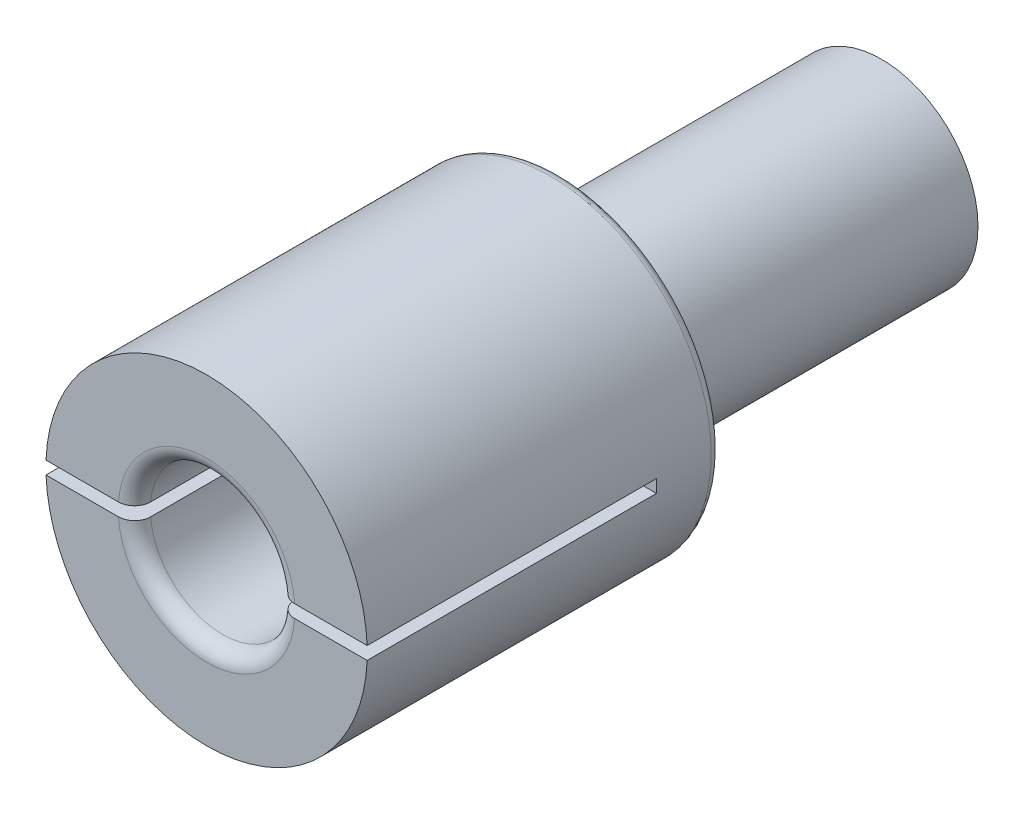
ISO-10303-21;
HEADER;
FILE_DESCRIPTION(('STEP AP214'),'2;1');
FILE_NAME('part.step','',(''),(''),'','','');
FILE_SCHEMA(('AUTOMOTIVE_DESIGN { 1 0 10303 214 1 1 1 1 }'));
ENDSEC;
DATA;
#1=APPLICATION_CONTEXT('core data for automotive mechanical design processes');
#2=APPLICATION_PROTOCOL_DEFINITION('international standard','automotive_design',2000,#1);
#3=PRODUCT_CONTEXT('',#1,'mechanical');
#4=PRODUCT('Part','Part','',(#3));
#5=PRODUCT_RELATED_PRODUCT_CATEGORY('part','',(#4));
#6=PRODUCT_DEFINITION_FORMATION('','',#4);
#7=PRODUCT_DEFINITION_CONTEXT('part definition',#1,'design');
#8=PRODUCT_DEFINITION('design','',#6,#7);
#9=PRODUCT_DEFINITION_SHAPE('','',#8);
#10=(LENGTH_UNIT() NAMED_UNIT(*) SI_UNIT(.MILLI.,.METRE.));
#11=(NAMED_UNIT(*) PLANE_ANGLE_UNIT() SI_UNIT($,.RADIAN.));
#12=(NAMED_UNIT(*) SI_UNIT($,.STERADIAN.) SOLID_ANGLE_UNIT());
#13=UNCERTAINTY_MEASURE_WITH_UNIT(LENGTH_MEASURE(1.E-05),#10,'distance_accuracy_value','');
#14=(GEOMETRIC_REPRESENTATION_CONTEXT(3) GLOBAL_UNCERTAINTY_ASSIGNED_CONTEXT((#13)) GLOBAL_UNIT_ASSIGNED_CONTEXT((#10,
#11,#12)) REPRESENTATION_CONTEXT('',''));
#15=CARTESIAN_POINT('',(0.,0.,0.));
#16=DIRECTION('',(0.,0.,1.));
#17=DIRECTION('',(1.,0.,0.));
#18=AXIS2_PLACEMENT_3D('',#15,#16,#17);
#19=CARTESIAN_POINT('',(-26.1833274784012,4.38375634517767,11.));
#20=DIRECTION('',(0.,0.,1.));
#21=DIRECTION('',(1.,0.,0.));
#22=AXIS2_PLACEMENT_3D('',#19,#20,#21);
#23=PLANE('',#22);
#24=DIRECTION('',(-1.,0.,0.));
#25=VECTOR('',#24,1.);
#26=CARTESIAN_POINT('',(-31.1833274784012,4.58375634517767,11.));
#27=LINE('',#26,#25);
#28=CARTESIAN_POINT('',(-28.9260451087817,4.58375634517767,11.));
#29=VERTEX_POINT('',#28);
#30=CARTESIAN_POINT('',(-31.1793258771199,4.58375634517767,11.));
#31=VERTEX_POINT('',#30);
#32=EDGE_CURVE('E130',#29,#31,#27,.T.);
#33=ORIENTED_EDGE('',*,*,#32,.F.);
#34=CARTESIAN_POINT('',(-26.1833274784012,4.38375634517767,11.));
#35=DIRECTION('',(0.,0.,1.));
#36=DIRECTION('',(1.,0.,0.));
#37=AXIS2_PLACEMENT_3D('',#34,#35,#36);
#38=CIRCLE('',#37,2.75);
#39=CARTESIAN_POINT('',(-23.4406098480207,4.58375634517767,11.));
#40=VERTEX_POINT('',#39);
#41=EDGE_CURVE('E46',#29,#40,#38,.F.);
#42=ORIENTED_EDGE('',*,*,#41,.T.);
#43=CARTESIAN_POINT('',(-21.1873290796824,4.58375634517767,11.));
#44=VERTEX_POINT('',#43);
#45=EDGE_CURVE('E366',#44,#40,#27,.T.);
#46=ORIENTED_EDGE('',*,*,#45,.F.);
#47=CARTESIAN_POINT('',(-26.1833274784012,4.38375634517767,11.));
#48=DIRECTION('',(0.,0.,1.));
#49=DIRECTION('',(1.,0.,0.));
#50=AXIS2_PLACEMENT_3D('',#47,#48,#49);
#51=CIRCLE('',#50,5.);
#52=EDGE_CURVE('E136',#44,#31,#51,.T.);
#53=ORIENTED_EDGE('',*,*,#52,.T.);
#54=EDGE_LOOP('',(#33,#42,#46,#53));
#55=FACE_BOUND('',#54,.T.);
#56=ADVANCED_FACE('F31',(#55),#23,.T.);
#57=CARTESIAN_POINT('',(-26.1833274784012,4.38375634517767,0.));
#58=DIRECTION('',(0.,0.,1.));
#59=DIRECTION('',(1.,0.,0.));
#60=AXIS2_PLACEMENT_3D('',#57,#58,#59);
#61=PLANE('',#60);
#62=CARTESIAN_POINT('',(-26.1833274784012,4.38375634517767,0.));
#63=DIRECTION('',(0.,0.,1.));
#64=DIRECTION('',(1.,0.,0.));
#65=AXIS2_PLACEMENT_3D('',#62,#63,#64);
#66=CIRCLE('',#65,4.7);
#67=CARTESIAN_POINT('',(-21.4833274784012,4.38375634517767,0.));
#68=VERTEX_POINT('',#67);
#69=EDGE_CURVE('E11',#68,#68,#66,.F.);
#70=ORIENTED_EDGE('',*,*,#69,.T.);
#71=EDGE_LOOP('',(#70));
#72=FACE_BOUND('',#71,.T.);
#73=CARTESIAN_POINT('',(-26.1833274784012,4.38375634517767,0.));
#74=DIRECTION('',(0.,0.,1.));
#75=DIRECTION('',(1.,0.,0.));
#76=AXIS2_PLACEMENT_3D('',#73,#74,#75);
#77=CIRCLE('',#76,3.);
#78=CARTESIAN_POINT('',(-23.1833274784012,4.38375634517767,0.));
#79=VERTEX_POINT('',#78);
#80=EDGE_CURVE('E140',#79,#79,#77,.F.);
#81=ORIENTED_EDGE('',*,*,#80,.F.);
#82=EDGE_LOOP('',(#81));
#83=FACE_BOUND('',#82,.T.);
#84=ADVANCED_FACE('F221',(#72,#83),#61,.F.);
#85=CARTESIAN_POINT('',(-26.1833274784012,4.38375634517767,11.));
#86=DIRECTION('',(0.,0.,-1.));
#87=DIRECTION('',(-1.,0.,0.));
#88=AXIS2_PLACEMENT_3D('',#85,#86,#87);
#89=CYLINDRICAL_SURFACE('',#88,5.);
#90=CARTESIAN_POINT('',(-26.1833274784012,4.38375634517767,0.3));
#91=DIRECTION('',(0.,0.,1.));
#92=DIRECTION('',(1.,0.,0.));
#93=AXIS2_PLACEMENT_3D('',#90,#91,#92);
#94=CIRCLE('',#93,5.);
#95=CARTESIAN_POINT('',(-21.1833274784012,4.38375634517767,0.3));
#96=VERTEX_POINT('',#95);
#97=EDGE_CURVE('E39',#96,#96,#94,.T.);
#98=ORIENTED_EDGE('',*,*,#97,.T.);
#99=EDGE_LOOP('',(#98));
#100=FACE_BOUND('',#99,.T.);
#101=CARTESIAN_POINT('',(-26.1833274784012,4.38375634517767,2.));
#102=DIRECTION('',(0.,0.,1.));
#103=DIRECTION('',(1.,0.,0.));
#104=AXIS2_PLACEMENT_3D('',#101,#102,#103);
#105=CIRCLE('',#104,5.);
#106=CARTESIAN_POINT('',(-31.1793258771199,4.58375634517767,2.));
#107=VERTEX_POINT('',#106);
#108=CARTESIAN_POINT('',(-31.1793258771199,4.18375634517767,2.));
#109=VERTEX_POINT('',#108);
#110=EDGE_CURVE('E362',#107,#109,#105,.T.);
#111=ORIENTED_EDGE('',*,*,#110,.F.);
#112=DIRECTION('',(0.,0.,-1.));
#113=VECTOR('',#112,1.);
#114=CARTESIAN_POINT('',(-31.1793258771199,4.58375634517767,11.));
#115=LINE('',#114,#113);
#116=EDGE_CURVE('E120',#107,#31,#115,.F.);
#117=ORIENTED_EDGE('',*,*,#116,.T.);
#118=ORIENTED_EDGE('',*,*,#52,.F.);
#119=DIRECTION('',(0.,0.,-1.));
#120=VECTOR('',#119,1.);
#121=CARTESIAN_POINT('',(-21.1873290796824,4.58375634517767,11.));
#122=LINE('',#121,#120);
#123=CARTESIAN_POINT('',(-21.1873290796824,4.58375634517767,2.));
#124=VERTEX_POINT('',#123);
#125=EDGE_CURVE('E355',#44,#124,#122,.T.);
#126=ORIENTED_EDGE('',*,*,#125,.T.);
#127=CARTESIAN_POINT('',(-21.1873290796824,4.18375634517767,2.));
#128=VERTEX_POINT('',#127);
#129=EDGE_CURVE('E363',#128,#124,#105,.T.);
#130=ORIENTED_EDGE('',*,*,#129,.F.);
#131=DIRECTION('',(0.,0.,-1.));
#132=VECTOR('',#131,1.);
#133=CARTESIAN_POINT('',(-21.1873290796824,4.18375634517767,11.));
#134=LINE('',#133,#132);
#135=CARTESIAN_POINT('',(-21.1873290796824,4.18375634517767,11.));
#136=VERTEX_POINT('',#135);
#137=EDGE_CURVE('E121',#128,#136,#134,.F.);
#138=ORIENTED_EDGE('',*,*,#137,.T.);
#139=CARTESIAN_POINT('',(-31.1793258771199,4.18375634517767,11.));
#140=VERTEX_POINT('',#139);
#141=EDGE_CURVE('E127',#140,#136,#51,.T.);
#142=ORIENTED_EDGE('',*,*,#141,.F.);
#143=DIRECTION('',(0.,0.,-1.));
#144=VECTOR('',#143,1.);
#145=CARTESIAN_POINT('',(-31.1793258771199,4.18375634517767,11.));
#146=LINE('',#145,#144);
#147=EDGE_CURVE('E110',#140,#109,#146,.T.);
#148=ORIENTED_EDGE('',*,*,#147,.T.);
#149=EDGE_LOOP('',(#111,#117,#118,#126,#130,#138,#142,#148));
#150=FACE_BOUND('',#149,.T.);
#151=ADVANCED_FACE('F134',(#100,#150),#89,.T.);
#152=DIRECTION('',(1.,0.,0.));
#153=VECTOR('',#152,1.);
#154=CARTESIAN_POINT('',(-31.1833274784012,4.18375634517767,11.));
#155=LINE('',#154,#153);
#156=CARTESIAN_POINT('',(-23.4406098480207,4.18375634517767,11.));
#157=VERTEX_POINT('',#156);
#158=EDGE_CURVE('E131',#157,#136,#155,.T.);
#159=ORIENTED_EDGE('',*,*,#158,.F.);
#160=CARTESIAN_POINT('',(-26.1833274784012,4.38375634517767,11.));
#161=DIRECTION('',(0.,0.,1.));
#162=DIRECTION('',(1.,0.,0.));
#163=AXIS2_PLACEMENT_3D('',#160,#161,#162);
#164=CIRCLE('',#163,2.75);
#165=CARTESIAN_POINT('',(-28.9260451087817,4.18375634517767,11.));
#166=VERTEX_POINT('',#165);
#167=EDGE_CURVE('E129',#157,#166,#164,.F.);
#168=ORIENTED_EDGE('',*,*,#167,.T.);
#169=EDGE_CURVE('E113',#140,#166,#155,.T.);
#170=ORIENTED_EDGE('',*,*,#169,.F.);
#171=ORIENTED_EDGE('',*,*,#141,.T.);
#172=EDGE_LOOP('',(#159,#168,#170,#171));
#173=FACE_BOUND('',#172,.T.);
#174=ADVANCED_FACE('F126',(#173),#23,.T.);
#175=CARTESIAN_POINT('',(-26.1833274784012,4.38375634517767,0.));
#176=DIRECTION('',(0.,0.,1.));
#177=DIRECTION('',(1.,0.,0.));
#178=AXIS2_PLACEMENT_3D('',#175,#176,#177);
#179=CYLINDRICAL_SURFACE('',#178,2.25);
#180=DIRECTION('',(0.,0.,1.));
#181=VECTOR('',#180,1.);
#182=CARTESIAN_POINT('',(-28.4244209615027,4.18375634517767,0.));
#183=LINE('',#182,#181);
#184=CARTESIAN_POINT('',(-28.4244209615027,4.18375634517767,2.));
#185=VERTEX_POINT('',#184);
#186=CARTESIAN_POINT('',(-28.4244209615027,4.18375634517767,10.5));
#187=VERTEX_POINT('',#186);
#188=EDGE_CURVE('E157',#185,#187,#183,.T.);
#189=ORIENTED_EDGE('',*,*,#188,.T.);
#190=CARTESIAN_POINT('',(-26.1833274784012,4.38375634517767,10.5));
#191=DIRECTION('',(0.,0.,1.));
#192=DIRECTION('',(1.,0.,0.));
#193=AXIS2_PLACEMENT_3D('',#190,#191,#192);
#194=CIRCLE('',#193,2.25);
#195=CARTESIAN_POINT('',(-23.9422339952997,4.18375634517767,10.5));
#196=VERTEX_POINT('',#195);
#197=EDGE_CURVE('E165',#187,#196,#194,.T.);
#198=ORIENTED_EDGE('',*,*,#197,.T.);
#199=DIRECTION('',(0.,0.,1.));
#200=VECTOR('',#199,1.);
#201=CARTESIAN_POINT('',(-23.9422339952997,4.18375634517767,0.));
#202=LINE('',#201,#200);
#203=CARTESIAN_POINT('',(-23.9422339952997,4.18375634517767,2.));
#204=VERTEX_POINT('',#203);
#205=EDGE_CURVE('E151',#196,#204,#202,.F.);
#206=ORIENTED_EDGE('',*,*,#205,.T.);
#207=CARTESIAN_POINT('',(-26.1833274784012,4.38375634517767,2.));
#208=DIRECTION('',(0.,0.,1.));
#209=DIRECTION('',(1.,0.,0.));
#210=AXIS2_PLACEMENT_3D('',#207,#208,#209);
#211=CIRCLE('',#210,2.25);
#212=CARTESIAN_POINT('',(-23.9422339952997,4.58375634517767,2.));
#213=VERTEX_POINT('',#212);
#214=EDGE_CURVE('E148',#213,#204,#211,.F.);
#215=ORIENTED_EDGE('',*,*,#214,.F.);
#216=DIRECTION('',(0.,0.,1.));
#217=VECTOR('',#216,1.);
#218=CARTESIAN_POINT('',(-23.9422339952997,4.58375634517767,0.));
#219=LINE('',#218,#217);
#220=CARTESIAN_POINT('',(-23.9422339952997,4.58375634517767,10.5));
#221=VERTEX_POINT('',#220);
#222=EDGE_CURVE('E154',#213,#221,#219,.T.);
#223=ORIENTED_EDGE('',*,*,#222,.T.);
#224=CARTESIAN_POINT('',(-26.1833274784012,4.38375634517767,10.5));
#225=DIRECTION('',(0.,0.,1.));
#226=DIRECTION('',(1.,0.,0.));
#227=AXIS2_PLACEMENT_3D('',#224,#225,#226);
#228=CIRCLE('',#227,2.25);
#229=CARTESIAN_POINT('',(-28.4244209615027,4.58375634517767,10.5));
#230=VERTEX_POINT('',#229);
#231=EDGE_CURVE('E162',#221,#230,#228,.T.);
#232=ORIENTED_EDGE('',*,*,#231,.T.);
#233=DIRECTION('',(0.,0.,1.));
#234=VECTOR('',#233,1.);
#235=CARTESIAN_POINT('',(-28.4244209615027,4.58375634517767,0.));
#236=LINE('',#235,#234);
#237=CARTESIAN_POINT('',(-28.4244209615027,4.58375634517767,2.));
#238=VERTEX_POINT('',#237);
#239=EDGE_CURVE('E160',#230,#238,#236,.F.);
#240=ORIENTED_EDGE('',*,*,#239,.T.);
#241=EDGE_CURVE('E152',#185,#238,#211,.F.);
#242=ORIENTED_EDGE('',*,*,#241,.F.);
#243=EDGE_LOOP('',(#189,#198,#206,#215,#223,#232,#240,#242));
#244=FACE_BOUND('',#243,.T.);
#245=CARTESIAN_POINT('',(-26.1833274784012,4.38375634517767,0.));
#246=DIRECTION('',(0.,0.,1.));
#247=DIRECTION('',(1.,0.,0.));
#248=AXIS2_PLACEMENT_3D('',#245,#246,#247);
#249=CIRCLE('',#248,2.25);
#250=CARTESIAN_POINT('',(-23.9333274784012,4.38375634517767,0.));
#251=VERTEX_POINT('',#250);
#252=EDGE_CURVE('E137',#251,#251,#249,.T.);
#253=ORIENTED_EDGE('',*,*,#252,.F.);
#254=EDGE_LOOP('',(#253));
#255=FACE_BOUND('',#254,.T.);
#256=ADVANCED_FACE('F230',(#244,#255),#179,.F.);
#257=CARTESIAN_POINT('',(-26.1833274784012,4.38375634517767,0.));
#258=DIRECTION('',(0.,0.,-1.));
#259=DIRECTION('',(-1.,0.,0.));
#260=AXIS2_PLACEMENT_3D('',#257,#258,#259);
#261=PLANE('',#260);
#262=ORIENTED_EDGE('',*,*,#252,.T.);
#263=EDGE_LOOP('',(#262));
#264=FACE_BOUND('',#263,.T.);
#265=ADVANCED_FACE('F235',(#264),#261,.F.);
#266=CARTESIAN_POINT('',(-26.1833274784012,4.38375634517767,-10.));
#267=DIRECTION('',(0.,0.,1.));
#268=DIRECTION('',(1.,0.,0.));
#269=AXIS2_PLACEMENT_3D('',#266,#267,#268);
#270=CYLINDRICAL_SURFACE('',#269,3.);
#271=CARTESIAN_POINT('',(-26.1833274784012,4.38375634517767,-10.));
#272=DIRECTION('',(0.,0.,-1.));
#273=DIRECTION('',(-1.,0.,0.));
#274=AXIS2_PLACEMENT_3D('',#271,#272,#273);
#275=CIRCLE('',#274,3.);
#276=CARTESIAN_POINT('',(-29.1833274784012,4.38375634517767,-10.));
#277=VERTEX_POINT('',#276);
#278=EDGE_CURVE('E142',#277,#277,#275,.T.);
#279=ORIENTED_EDGE('',*,*,#278,.F.);
#280=EDGE_LOOP('',(#279));
#281=FACE_BOUND('',#280,.T.);
#282=ORIENTED_EDGE('',*,*,#80,.T.);
#283=EDGE_LOOP('',(#282));
#284=FACE_BOUND('',#283,.T.);
#285=ADVANCED_FACE('F329',(#281,#284),#270,.T.);
#286=CARTESIAN_POINT('',(-26.1833274784012,4.38375634517767,-10.));
#287=DIRECTION('',(0.,0.,-1.));
#288=DIRECTION('',(-1.,0.,0.));
#289=AXIS2_PLACEMENT_3D('',#286,#287,#288);
#290=PLANE('',#289);
#291=ORIENTED_EDGE('',*,*,#278,.T.);
#292=EDGE_LOOP('',(#291));
#293=FACE_BOUND('',#292,.T.);
#294=ADVANCED_FACE('F189',(#293),#290,.T.);
#295=CARTESIAN_POINT('',(-31.1833274784012,4.38375634517767,2.));
#296=DIRECTION('',(0.,0.,1.));
#297=DIRECTION('',(1.,0.,0.));
#298=AXIS2_PLACEMENT_3D('',#295,#296,#297);
#299=PLANE('',#298);
#300=ORIENTED_EDGE('',*,*,#129,.T.);
#301=DIRECTION('',(-1.,0.,0.));
#302=VECTOR('',#301,1.);
#303=CARTESIAN_POINT('',(-31.1833274784012,4.58375634517767,2.));
#304=LINE('',#303,#302);
#305=EDGE_CURVE('E365',#124,#213,#304,.T.);
#306=ORIENTED_EDGE('',*,*,#305,.T.);
#307=ORIENTED_EDGE('',*,*,#214,.T.);
#308=DIRECTION('',(1.,0.,0.));
#309=VECTOR('',#308,1.);
#310=CARTESIAN_POINT('',(-31.1833274784012,4.18375634517767,2.));
#311=LINE('',#310,#309);
#312=EDGE_CURVE('E371',#204,#128,#311,.T.);
#313=ORIENTED_EDGE('',*,*,#312,.T.);
#314=EDGE_LOOP('',(#300,#306,#307,#313));
#315=FACE_BOUND('',#314,.T.);
#316=ADVANCED_FACE('F292',(#315),#299,.T.);
#317=CARTESIAN_POINT('',(-31.1833274784012,4.18375634517767,2.));
#318=DIRECTION('',(0.,-1.,0.));
#319=DIRECTION('',(1.,0.,0.));
#320=AXIS2_PLACEMENT_3D('',#317,#318,#319);
#321=PLANE('',#320);
#322=ORIENTED_EDGE('',*,*,#205,.F.);
#323=CARTESIAN_POINT('',(-23.9422339952997,4.18375634517767,10.5));
#324=CARTESIAN_POINT('',(-23.9422584428226,4.18375634517767,10.5280536582379));
#325=CARTESIAN_POINT('',(-23.9398650669706,4.18375634517767,10.5560993826151));
#326=CARTESIAN_POINT('',(-23.930424069559,4.18375634517767,10.6113711028899));
#327=CARTESIAN_POINT('',(-23.9233806889157,4.18375634517767,10.638597822105));
#328=CARTESIAN_POINT('',(-23.9048164509858,4.18375634517767,10.6914930828795));
#329=CARTESIAN_POINT('',(-23.8932936516399,4.18375634517767,10.7171609430046));
#330=CARTESIAN_POINT('',(-23.8661139371574,4.18375634517767,10.7661997685074));
#331=CARTESIAN_POINT('',(-23.8504575926033,4.18375634517767,10.7895710502876));
#332=CARTESIAN_POINT('',(-23.8154230257549,4.18375634517767,10.833408801733));
#333=CARTESIAN_POINT('',(-23.7960376111717,4.18375634517767,10.8538695229241));
#334=CARTESIAN_POINT('',(-23.7541134309621,4.18375634517767,10.8912642181422));
#335=CARTESIAN_POINT('',(-23.7315740197026,4.18375634517767,10.908197468314));
#336=CARTESIAN_POINT('',(-23.6838968590264,4.18375634517767,10.9381164746569));
#337=CARTESIAN_POINT('',(-23.6587497226587,4.18375634517767,10.951087256436));
#338=CARTESIAN_POINT('',(-23.6066431295319,4.18375634517767,10.9726281066423));
#339=CARTESIAN_POINT('',(-23.57968468215,4.18375634517767,10.9812006034429));
#340=CARTESIAN_POINT('',(-23.533909762425,4.18375634517767,10.9916237829409));
#341=CARTESIAN_POINT('',(-23.5153762833676,4.18375634517767,10.9947627344621));
#342=CARTESIAN_POINT('',(-23.4781010461401,4.18375634517767,10.99895063573));
#343=CARTESIAN_POINT('',(-23.4593596160856,4.18375634517767,11.00000250692));
#344=CARTESIAN_POINT('',(-23.4406098480207,4.18375634517767,11.));
#345=B_SPLINE_CURVE_WITH_KNOTS('',3,(#323,#324,#325,#326,#327,#328,#329,#330,#331,#332,#333,
#334,#335,#336,#337,#338,#339,#340,#341,#342,#343,#344),.UNSPECIFIED.,.F.,.F.,(4,2,2,2,2,2,2,2,
2,2,4),(0.,0.0840475464943327,0.168018545299725,0.252025990544331,0.336021845705834,
0.42018135880118,0.504358124885941,0.588849172990336,0.673293521710334,0.729575999512429,
0.785779638760285),.UNSPECIFIED.);
#346=EDGE_CURVE('E168',#196,#157,#345,.T.);
#347=ORIENTED_EDGE('',*,*,#346,.T.);
#348=ORIENTED_EDGE('',*,*,#158,.T.);
#349=ORIENTED_EDGE('',*,*,#137,.F.);
#350=ORIENTED_EDGE('',*,*,#312,.F.);
#351=EDGE_LOOP('',(#322,#347,#348,#349,#350));
#352=FACE_BOUND('',#351,.T.);
#353=ADVANCED_FACE('F185',(#352),#321,.F.);
#354=CARTESIAN_POINT('',(-31.1833274784012,4.58375634517767,2.));
#355=DIRECTION('',(0.,1.,0.));
#356=DIRECTION('',(-1.,0.,0.));
#357=AXIS2_PLACEMENT_3D('',#354,#355,#356);
#358=PLANE('',#357);
#359=ORIENTED_EDGE('',*,*,#45,.T.);
#360=CARTESIAN_POINT('',(-23.4406098480207,4.58375634517767,11.));
#361=CARTESIAN_POINT('',(-23.4688883149799,4.58375634517767,11.0000235814152));
#362=CARTESIAN_POINT('',(-23.4971596429571,4.58375634517767,10.9976150756412));
#363=CARTESIAN_POINT('',(-23.5528828082673,4.58375634517767,10.9881102397441));
#364=CARTESIAN_POINT('',(-23.5803352284384,4.58375634517767,10.9810173310607));
#365=CARTESIAN_POINT('',(-23.6336718176992,4.58375634517767,10.9623150435565));
#366=CARTESIAN_POINT('',(-23.6595552215599,4.58375634517767,10.950703481091));
#367=CARTESIAN_POINT('',(-23.7089992265589,4.58375634517767,10.92330038982));
#368=CARTESIAN_POINT('',(-23.7325602575439,4.58375634517767,10.9075096365398));
#369=CARTESIAN_POINT('',(-23.7766744990959,4.58375634517767,10.8722026383571));
#370=CARTESIAN_POINT('',(-23.7972299035663,4.58375634517767,10.8526891350315));
#371=CARTESIAN_POINT('',(-23.8347658780096,4.58375634517767,10.8104747844503));
#372=CARTESIAN_POINT('',(-23.8517457767686,4.58375634517767,10.7877733400675));
#373=CARTESIAN_POINT('',(-23.8815925316932,4.58375634517767,10.7398971415226));
#374=CARTESIAN_POINT('',(-23.8944701440796,4.58375634517767,10.714729085516));
#375=CARTESIAN_POINT('',(-23.9157928848849,4.58375634517767,10.6625882754134));
#376=CARTESIAN_POINT('',(-23.9242408507603,4.58375634517767,10.6356166891046));
#377=CARTESIAN_POINT('',(-23.9343008513218,4.58375634517767,10.590392009309));
#378=CARTESIAN_POINT('',(-23.9372739361646,4.58375634517767,10.5724300690191));
#379=CARTESIAN_POINT('',(-23.941240223291,4.58375634517767,10.5363146765164));
#380=CARTESIAN_POINT('',(-23.9422362181761,4.58375634517767,10.5181615308906));
#381=CARTESIAN_POINT('',(-23.9422339952997,4.58375634517767,10.5));
#382=B_SPLINE_CURVE_WITH_KNOTS('',3,(#360,#361,#362,#363,#364,#365,#366,#367,#368,#369,#370,
#371,#372,#373,#374,#375,#376,#377,#378,#379,#380,#381),.UNSPECIFIED.,.F.,.F.,(4,2,2,2,2,2,2,2,
2,2,4),(0.,0.0847228639140904,0.169383915452655,0.25408593045014,0.338772238446567,
0.423396419252602,0.508036472046686,0.592452735739122,0.676814859447091,0.731332896920135,
0.78577387376911),.UNSPECIFIED.);
#383=EDGE_CURVE('E207',#40,#221,#382,.T.);
#384=ORIENTED_EDGE('',*,*,#383,.T.);
#385=ORIENTED_EDGE('',*,*,#222,.F.);
#386=ORIENTED_EDGE('',*,*,#305,.F.);
#387=ORIENTED_EDGE('',*,*,#125,.F.);
#388=EDGE_LOOP('',(#359,#384,#385,#386,#387));
#389=FACE_BOUND('',#388,.T.);
#390=ADVANCED_FACE('F186',(#389),#358,.F.);
#391=ORIENTED_EDGE('',*,*,#239,.F.);
#392=CARTESIAN_POINT('',(-28.4244209615027,4.58375634517767,10.5));
#393=CARTESIAN_POINT('',(-28.4243965139797,4.58375634517767,10.5280536582379));
#394=CARTESIAN_POINT('',(-28.4267898898317,4.58375634517767,10.5560993826151));
#395=CARTESIAN_POINT('',(-28.4362308872433,4.58375634517767,10.6113711028899));
#396=CARTESIAN_POINT('',(-28.4432742678866,4.58375634517767,10.638597822105));
#397=CARTESIAN_POINT('',(-28.4618385058165,4.58375634517767,10.6914930828795));
#398=CARTESIAN_POINT('',(-28.4733613051624,4.58375634517767,10.7171609430046));
#399=CARTESIAN_POINT('',(-28.5005410196449,4.58375634517767,10.7661997685074));
#400=CARTESIAN_POINT('',(-28.516197364199,4.58375634517767,10.7895710502876));
#401=CARTESIAN_POINT('',(-28.5512319310474,4.58375634517767,10.833408801733));
#402=CARTESIAN_POINT('',(-28.5706173456306,4.58375634517767,10.8538695229241));
#403=CARTESIAN_POINT('',(-28.6125415258402,4.58375634517767,10.8912642181422));
#404=CARTESIAN_POINT('',(-28.6350809370997,4.58375634517767,10.908197468314));
#405=CARTESIAN_POINT('',(-28.6827580977759,4.58375634517767,10.9381164746569));
#406=CARTESIAN_POINT('',(-28.7079052341436,4.58375634517767,10.951087256436));
#407=CARTESIAN_POINT('',(-28.7600118272704,4.58375634517767,10.9726281066423));
#408=CARTESIAN_POINT('',(-28.7869702746523,4.58375634517767,10.9812006034429));
#409=CARTESIAN_POINT('',(-28.8327451943773,4.58375634517767,10.9916237829409));
#410=CARTESIAN_POINT('',(-28.8512786734347,4.58375634517767,10.9947627344621));
#411=CARTESIAN_POINT('',(-28.8885539106622,4.58375634517767,10.99895063573));
#412=CARTESIAN_POINT('',(-28.9072953407167,4.58375634517767,11.00000250692));
#413=CARTESIAN_POINT('',(-28.9260451087816,4.58375634517767,11.));
#414=B_SPLINE_CURVE_WITH_KNOTS('',3,(#392,#393,#394,#395,#396,#397,#398,#399,#400,#401,#402,
#403,#404,#405,#406,#407,#408,#409,#410,#411,#412,#413),.UNSPECIFIED.,.F.,.F.,(4,2,2,2,2,2,2,2,
2,2,4),(0.,0.0840475464943327,0.168018545299725,0.252025990544331,0.336021845705834,
0.420181358801179,0.50435812488594,0.588849172990336,0.673293521710333,0.729575999512429,
0.785779638760284),.UNSPECIFIED.);
#415=EDGE_CURVE('E54',#230,#29,#414,.T.);
#416=ORIENTED_EDGE('',*,*,#415,.T.);
#417=ORIENTED_EDGE('',*,*,#32,.T.);
#418=ORIENTED_EDGE('',*,*,#116,.F.);
#419=EDGE_CURVE('E368',#238,#107,#304,.T.);
#420=ORIENTED_EDGE('',*,*,#419,.F.);
#421=EDGE_LOOP('',(#391,#416,#417,#418,#420));
#422=FACE_BOUND('',#421,.T.);
#423=ADVANCED_FACE('F184',(#422),#358,.F.);
#424=ORIENTED_EDGE('',*,*,#169,.T.);
#425=CARTESIAN_POINT('',(-28.9260451087817,4.18375634517767,11.));
#426=CARTESIAN_POINT('',(-28.8977666418224,4.18375634517767,11.0000235814152));
#427=CARTESIAN_POINT('',(-28.8694953138452,4.18375634517767,10.9976150756412));
#428=CARTESIAN_POINT('',(-28.813772148535,4.18375634517767,10.9881102397441));
#429=CARTESIAN_POINT('',(-28.7863197283639,4.18375634517767,10.9810173310607));
#430=CARTESIAN_POINT('',(-28.7329831391031,4.18375634517767,10.9623150435565));
#431=CARTESIAN_POINT('',(-28.7070997352424,4.18375634517767,10.950703481091));
#432=CARTESIAN_POINT('',(-28.6576557302434,4.18375634517767,10.92330038982));
#433=CARTESIAN_POINT('',(-28.6340946992584,4.18375634517767,10.9075096365398));
#434=CARTESIAN_POINT('',(-28.5899804577064,4.18375634517767,10.8722026383571));
#435=CARTESIAN_POINT('',(-28.569425053236,4.18375634517767,10.8526891350315));
#436=CARTESIAN_POINT('',(-28.5318890787927,4.18375634517767,10.8104747844503));
#437=CARTESIAN_POINT('',(-28.5149091800337,4.18375634517767,10.7877733400675));
#438=CARTESIAN_POINT('',(-28.4850624251091,4.18375634517767,10.7398971415226));
#439=CARTESIAN_POINT('',(-28.4721848127227,4.18375634517767,10.714729085516));
#440=CARTESIAN_POINT('',(-28.4508620719174,4.18375634517767,10.6625882754134));
#441=CARTESIAN_POINT('',(-28.442414106042,4.18375634517767,10.6356166891046));
#442=CARTESIAN_POINT('',(-28.4323541054805,4.18375634517767,10.590392009309));
#443=CARTESIAN_POINT('',(-28.4293810206378,4.18375634517767,10.5724300690191));
#444=CARTESIAN_POINT('',(-28.4254147335113,4.18375634517767,10.5363146765164));
#445=CARTESIAN_POINT('',(-28.4244187386262,4.18375634517767,10.5181615308906));
#446=CARTESIAN_POINT('',(-28.4244209615027,4.18375634517767,10.5));
#447=B_SPLINE_CURVE_WITH_KNOTS('',3,(#425,#426,#427,#428,#429,#430,#431,#432,#433,#434,#435,
#436,#437,#438,#439,#440,#441,#442,#443,#444,#445,#446),.UNSPECIFIED.,.F.,.F.,(4,2,2,2,2,2,2,2,
2,2,4),(0.,0.0847228639140904,0.169383915452655,0.25408593045014,0.338772238446568,
0.423396419252602,0.508036472046686,0.592452735739122,0.676814859447091,0.731332896920135,
0.78577387376911),.UNSPECIFIED.);
#448=EDGE_CURVE('E192',#166,#187,#447,.T.);
#449=ORIENTED_EDGE('',*,*,#448,.T.);
#450=ORIENTED_EDGE('',*,*,#188,.F.);
#451=EDGE_CURVE('E116',#109,#185,#311,.T.);
#452=ORIENTED_EDGE('',*,*,#451,.F.);
#453=ORIENTED_EDGE('',*,*,#147,.F.);
#454=EDGE_LOOP('',(#424,#449,#450,#452,#453));
#455=FACE_BOUND('',#454,.T.);
#456=ADVANCED_FACE('F112',(#455),#321,.F.);
#457=ORIENTED_EDGE('',*,*,#110,.T.);
#458=ORIENTED_EDGE('',*,*,#451,.T.);
#459=ORIENTED_EDGE('',*,*,#241,.T.);
#460=ORIENTED_EDGE('',*,*,#419,.T.);
#461=EDGE_LOOP('',(#457,#458,#459,#460));
#462=FACE_BOUND('',#461,.T.);
#463=ADVANCED_FACE('F183',(#462),#299,.T.);
#464=CARTESIAN_POINT('',(-26.1833274784012,4.38375634517767,10.5));
#465=DIRECTION('',(0.,0.,1.));
#466=DIRECTION('',(1.,0.,0.));
#467=AXIS2_PLACEMENT_3D('',#464,#465,#466);
#468=TOROIDAL_SURFACE('',#467,2.75,0.5);
#469=ORIENTED_EDGE('',*,*,#448,.F.);
#470=ORIENTED_EDGE('',*,*,#167,.F.);
#471=ORIENTED_EDGE('',*,*,#346,.F.);
#472=ORIENTED_EDGE('',*,*,#197,.F.);
#473=EDGE_LOOP('',(#469,#470,#471,#472));
#474=FACE_BOUND('',#473,.T.);
#475=ADVANCED_FACE('F176',(#474),#468,.T.);
#476=CARTESIAN_POINT('',(-26.1833274784012,4.38375634517767,10.5));
#477=DIRECTION('',(0.,0.,1.));
#478=DIRECTION('',(1.,0.,0.));
#479=AXIS2_PLACEMENT_3D('',#476,#477,#478);
#480=TOROIDAL_SURFACE('',#479,2.75,0.5);
#481=ORIENTED_EDGE('',*,*,#383,.F.);
#482=ORIENTED_EDGE('',*,*,#41,.F.);
#483=ORIENTED_EDGE('',*,*,#415,.F.);
#484=ORIENTED_EDGE('',*,*,#231,.F.);
#485=EDGE_LOOP('',(#481,#482,#483,#484));
#486=FACE_BOUND('',#485,.T.);
#487=ADVANCED_FACE('F202',(#486),#480,.T.);
#488=CARTESIAN_POINT('',(-26.1833274784012,4.38375634517767,0.3));
#489=DIRECTION('',(0.,0.,1.));
#490=DIRECTION('',(1.,0.,0.));
#491=AXIS2_PLACEMENT_3D('',#488,#489,#490);
#492=TOROIDAL_SURFACE('',#491,4.7,0.3);
#493=ORIENTED_EDGE('',*,*,#69,.F.);
#494=EDGE_LOOP('',(#493));
#495=FACE_BOUND('',#494,.T.);
#496=ORIENTED_EDGE('',*,*,#97,.F.);
#497=EDGE_LOOP('',(#496));
#498=FACE_BOUND('',#497,.T.);
#499=ADVANCED_FACE('F33',(#495,#498),#492,.T.);
#500=CLOSED_SHELL('',(#56,#84,#151,#174,#256,#265,#285,#294,#316,#353,#390,#423,#456,#463,#475,
#487,#499));
#501=MANIFOLD_SOLID_BREP('B2',#500);
#502=ADVANCED_BREP_SHAPE_REPRESENTATION('',(#18,#501),#14);
#503=SHAPE_DEFINITION_REPRESENTATION(#9,#502);
ENDSEC;
END-ISO-10303-21;
